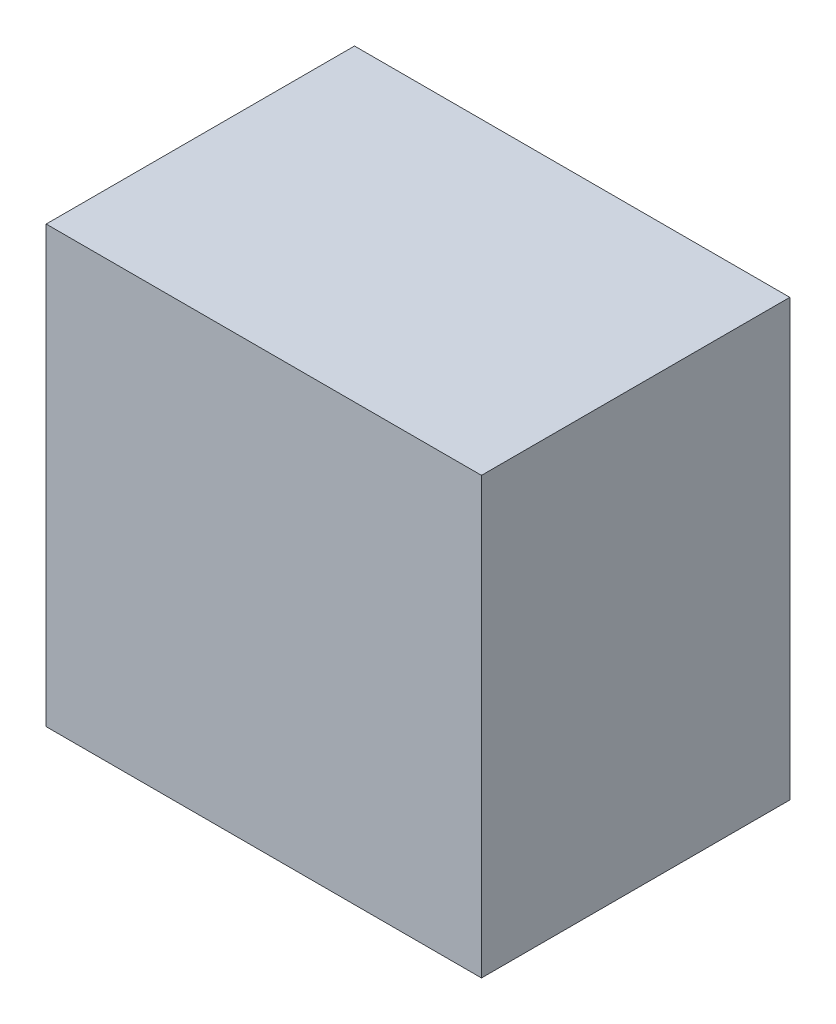
ISO-10303-21;
HEADER;
FILE_DESCRIPTION(('STEP AP214'),'2;1');
FILE_NAME('part.step','',(''),(''),'','','');
FILE_SCHEMA(('AUTOMOTIVE_DESIGN { 1 0 10303 214 1 1 1 1 }'));
ENDSEC;
DATA;
#1=APPLICATION_CONTEXT('core data for automotive mechanical design processes');
#2=APPLICATION_PROTOCOL_DEFINITION('international standard','automotive_design',2000,#1);
#3=PRODUCT_CONTEXT('',#1,'mechanical');
#4=PRODUCT('Part','Part','',(#3));
#5=PRODUCT_RELATED_PRODUCT_CATEGORY('part','',(#4));
#6=PRODUCT_DEFINITION_FORMATION('','',#4);
#7=PRODUCT_DEFINITION_CONTEXT('part definition',#1,'design');
#8=PRODUCT_DEFINITION('design','',#6,#7);
#9=PRODUCT_DEFINITION_SHAPE('','',#8);
#10=(LENGTH_UNIT() NAMED_UNIT(*) SI_UNIT(.MILLI.,.METRE.));
#11=(NAMED_UNIT(*) PLANE_ANGLE_UNIT() SI_UNIT($,.RADIAN.));
#12=(NAMED_UNIT(*) SI_UNIT($,.STERADIAN.) SOLID_ANGLE_UNIT());
#13=UNCERTAINTY_MEASURE_WITH_UNIT(LENGTH_MEASURE(1.E-05),#10,'distance_accuracy_value','');
#14=(GEOMETRIC_REPRESENTATION_CONTEXT(3) GLOBAL_UNCERTAINTY_ASSIGNED_CONTEXT((#13)) GLOBAL_UNIT_ASSIGNED_CONTEXT((#10,
#11,#12)) REPRESENTATION_CONTEXT('',''));
#15=CARTESIAN_POINT('',(0.,0.,0.));
#16=DIRECTION('',(0.,0.,1.));
#17=DIRECTION('',(1.,0.,0.));
#18=AXIS2_PLACEMENT_3D('',#15,#16,#17);
#19=CARTESIAN_POINT('',(2.99999908,2.99999908,0.));
#20=DIRECTION('',(0.,-1.,0.));
#21=DIRECTION('',(-1.,0.,0.));
#22=AXIS2_PLACEMENT_3D('',#19,#20,#21);
#23=PLANE('',#22);
#24=DIRECTION('',(-1.,0.,0.));
#25=VECTOR('',#24,1.);
#26=CARTESIAN_POINT('',(2.99999908,2.99999908,0.));
#27=LINE('',#26,#25);
#28=CARTESIAN_POINT('',(2.99999908,2.99999908,0.));
#29=VERTEX_POINT('',#28);
#30=CARTESIAN_POINT('',(-2.99999908,2.99999908,0.));
#31=VERTEX_POINT('',#30);
#32=EDGE_CURVE('E11',#29,#31,#27,.T.);
#33=ORIENTED_EDGE('',*,*,#32,.T.);
#34=DIRECTION('',(0.,0.,1.));
#35=VECTOR('',#34,1.);
#36=CARTESIAN_POINT('',(-2.99999908,2.99999908,0.));
#37=LINE('',#36,#35);
#38=CARTESIAN_POINT('',(-2.99999908,2.99999908,4.24999912));
#39=VERTEX_POINT('',#38);
#40=EDGE_CURVE('E24',#31,#39,#37,.T.);
#41=ORIENTED_EDGE('',*,*,#40,.T.);
#42=DIRECTION('',(-1.,0.,0.));
#43=VECTOR('',#42,1.);
#44=CARTESIAN_POINT('',(2.99999908,2.99999908,4.24999912));
#45=LINE('',#44,#43);
#46=CARTESIAN_POINT('',(2.99999908,2.99999908,4.24999912));
#47=VERTEX_POINT('',#46);
#48=EDGE_CURVE('E87',#47,#39,#45,.T.);
#49=ORIENTED_EDGE('',*,*,#48,.F.);
#50=DIRECTION('',(0.,0.,1.));
#51=VECTOR('',#50,1.);
#52=CARTESIAN_POINT('',(2.99999908,2.99999908,0.));
#53=LINE('',#52,#51);
#54=EDGE_CURVE('E36',#29,#47,#53,.T.);
#55=ORIENTED_EDGE('',*,*,#54,.F.);
#56=EDGE_LOOP('',(#33,#41,#49,#55));
#57=FACE_BOUND('',#56,.T.);
#58=ADVANCED_FACE('F17',(#57),#23,.F.);
#59=CARTESIAN_POINT('',(-2.99999908,2.99999908,0.));
#60=DIRECTION('',(1.,0.,0.));
#61=DIRECTION('',(0.,-1.,0.));
#62=AXIS2_PLACEMENT_3D('',#59,#60,#61);
#63=PLANE('',#62);
#64=DIRECTION('',(0.,-1.,0.));
#65=VECTOR('',#64,1.);
#66=CARTESIAN_POINT('',(-2.99999908,2.99999908,0.));
#67=LINE('',#66,#65);
#68=CARTESIAN_POINT('',(-2.99999908,-2.99999908,0.));
#69=VERTEX_POINT('',#68);
#70=EDGE_CURVE('E84',#31,#69,#67,.T.);
#71=ORIENTED_EDGE('',*,*,#70,.T.);
#72=DIRECTION('',(0.,0.,1.));
#73=VECTOR('',#72,1.);
#74=CARTESIAN_POINT('',(-2.99999908,-2.99999908,0.));
#75=LINE('',#74,#73);
#76=CARTESIAN_POINT('',(-2.99999908,-2.99999908,4.24999912));
#77=VERTEX_POINT('',#76);
#78=EDGE_CURVE('E82',#69,#77,#75,.T.);
#79=ORIENTED_EDGE('',*,*,#78,.T.);
#80=DIRECTION('',(0.,-1.,0.));
#81=VECTOR('',#80,1.);
#82=CARTESIAN_POINT('',(-2.99999908,2.99999908,4.24999912));
#83=LINE('',#82,#81);
#84=EDGE_CURVE('E62',#39,#77,#83,.T.);
#85=ORIENTED_EDGE('',*,*,#84,.F.);
#86=ORIENTED_EDGE('',*,*,#40,.F.);
#87=EDGE_LOOP('',(#71,#79,#85,#86));
#88=FACE_BOUND('',#87,.T.);
#89=ADVANCED_FACE('F89',(#88),#63,.F.);
#90=CARTESIAN_POINT('',(-2.99999908,-2.99999908,0.));
#91=DIRECTION('',(0.,1.,0.));
#92=DIRECTION('',(1.,0.,0.));
#93=AXIS2_PLACEMENT_3D('',#90,#91,#92);
#94=PLANE('',#93);
#95=DIRECTION('',(1.,0.,0.));
#96=VECTOR('',#95,1.);
#97=CARTESIAN_POINT('',(-2.99999908,-2.99999908,0.));
#98=LINE('',#97,#96);
#99=CARTESIAN_POINT('',(2.99999908,-2.99999908,0.));
#100=VERTEX_POINT('',#99);
#101=EDGE_CURVE('E71',#69,#100,#98,.T.);
#102=ORIENTED_EDGE('',*,*,#101,.T.);
#103=DIRECTION('',(0.,0.,1.));
#104=VECTOR('',#103,1.);
#105=CARTESIAN_POINT('',(2.99999908,-2.99999908,0.));
#106=LINE('',#105,#104);
#107=CARTESIAN_POINT('',(2.99999908,-2.99999908,4.24999912));
#108=VERTEX_POINT('',#107);
#109=EDGE_CURVE('E65',#100,#108,#106,.T.);
#110=ORIENTED_EDGE('',*,*,#109,.T.);
#111=DIRECTION('',(1.,0.,0.));
#112=VECTOR('',#111,1.);
#113=CARTESIAN_POINT('',(-2.99999908,-2.99999908,4.24999912));
#114=LINE('',#113,#112);
#115=EDGE_CURVE('E57',#77,#108,#114,.T.);
#116=ORIENTED_EDGE('',*,*,#115,.F.);
#117=ORIENTED_EDGE('',*,*,#78,.F.);
#118=EDGE_LOOP('',(#102,#110,#116,#117));
#119=FACE_BOUND('',#118,.T.);
#120=ADVANCED_FACE('F69',(#119),#94,.F.);
#121=CARTESIAN_POINT('',(2.99999908,-2.99999908,0.));
#122=DIRECTION('',(-1.,0.,0.));
#123=DIRECTION('',(0.,1.,0.));
#124=AXIS2_PLACEMENT_3D('',#121,#122,#123);
#125=PLANE('',#124);
#126=DIRECTION('',(0.,1.,0.));
#127=VECTOR('',#126,1.);
#128=CARTESIAN_POINT('',(2.99999908,-2.99999908,0.));
#129=LINE('',#128,#127);
#130=EDGE_CURVE('E66',#100,#29,#129,.T.);
#131=ORIENTED_EDGE('',*,*,#130,.T.);
#132=ORIENTED_EDGE('',*,*,#54,.T.);
#133=DIRECTION('',(0.,1.,0.));
#134=VECTOR('',#133,1.);
#135=CARTESIAN_POINT('',(2.99999908,-2.99999908,4.24999912));
#136=LINE('',#135,#134);
#137=EDGE_CURVE('E61',#108,#47,#136,.T.);
#138=ORIENTED_EDGE('',*,*,#137,.F.);
#139=ORIENTED_EDGE('',*,*,#109,.F.);
#140=EDGE_LOOP('',(#131,#132,#138,#139));
#141=FACE_BOUND('',#140,.T.);
#142=ADVANCED_FACE('F76',(#141),#125,.F.);
#143=CARTESIAN_POINT('',(2.99999908,2.99999908,0.));
#144=DIRECTION('',(0.,0.,-1.));
#145=DIRECTION('',(-1.,0.,0.));
#146=AXIS2_PLACEMENT_3D('',#143,#144,#145);
#147=PLANE('',#146);
#148=ORIENTED_EDGE('',*,*,#130,.F.);
#149=ORIENTED_EDGE('',*,*,#101,.F.);
#150=ORIENTED_EDGE('',*,*,#70,.F.);
#151=ORIENTED_EDGE('',*,*,#32,.F.);
#152=EDGE_LOOP('',(#148,#149,#150,#151));
#153=FACE_BOUND('',#152,.T.);
#154=ADVANCED_FACE('F91',(#153),#147,.T.);
#155=CARTESIAN_POINT('',(2.99999908,2.99999908,4.24999912));
#156=DIRECTION('',(0.,0.,-1.));
#157=DIRECTION('',(-1.,0.,0.));
#158=AXIS2_PLACEMENT_3D('',#155,#156,#157);
#159=PLANE('',#158);
#160=ORIENTED_EDGE('',*,*,#48,.T.);
#161=ORIENTED_EDGE('',*,*,#84,.T.);
#162=ORIENTED_EDGE('',*,*,#115,.T.);
#163=ORIENTED_EDGE('',*,*,#137,.T.);
#164=EDGE_LOOP('',(#160,#161,#162,#163));
#165=FACE_BOUND('',#164,.T.);
#166=ADVANCED_FACE('F59',(#165),#159,.F.);
#167=CLOSED_SHELL('',(#58,#89,#120,#142,#154,#166));
#168=MANIFOLD_SOLID_BREP('B1',#167);
#169=ADVANCED_BREP_SHAPE_REPRESENTATION('',(#18,#168),#14);
#170=SHAPE_DEFINITION_REPRESENTATION(#9,#169);
ENDSEC;
END-ISO-10303-21;
